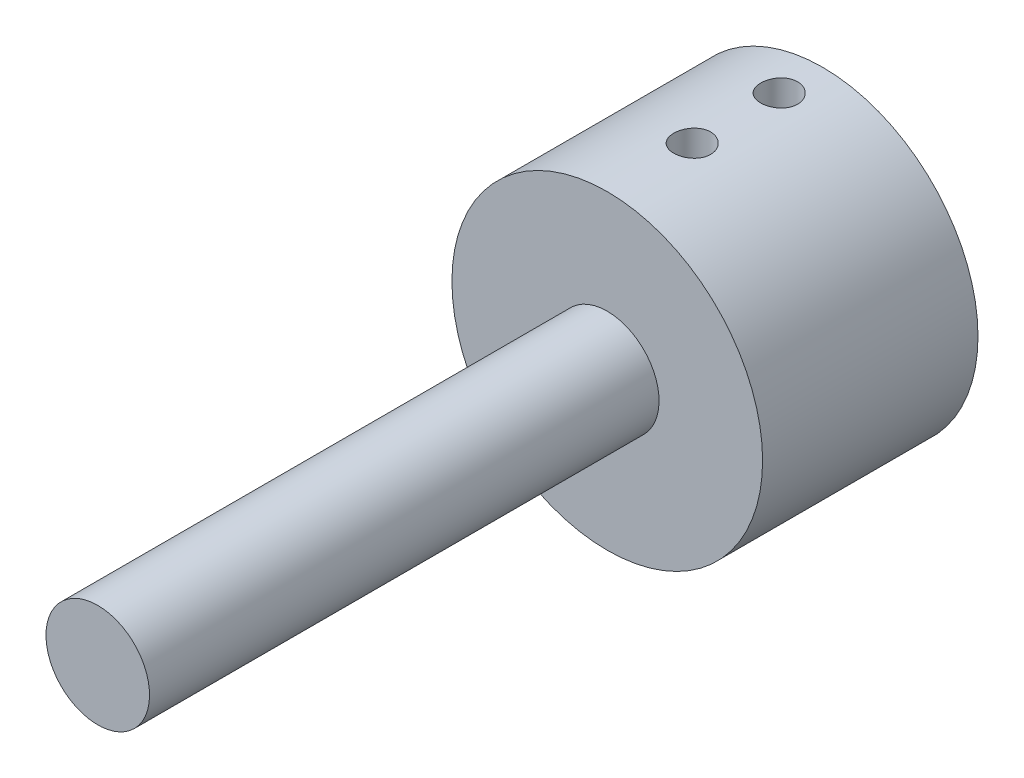
ISO-10303-21;
HEADER;
FILE_DESCRIPTION(('STEP AP214'),'2;1');
FILE_NAME('part.step','',(''),(''),'','','');
FILE_SCHEMA(('AUTOMOTIVE_DESIGN { 1 0 10303 214 1 1 1 1 }'));
ENDSEC;
DATA;
#1=APPLICATION_CONTEXT('core data for automotive mechanical design processes');
#2=APPLICATION_PROTOCOL_DEFINITION('international standard','automotive_design',2000,#1);
#3=PRODUCT_CONTEXT('',#1,'mechanical');
#4=PRODUCT('Part','Part','',(#3));
#5=PRODUCT_RELATED_PRODUCT_CATEGORY('part','',(#4));
#6=PRODUCT_DEFINITION_FORMATION('','',#4);
#7=PRODUCT_DEFINITION_CONTEXT('part definition',#1,'design');
#8=PRODUCT_DEFINITION('design','',#6,#7);
#9=PRODUCT_DEFINITION_SHAPE('','',#8);
#10=(LENGTH_UNIT() NAMED_UNIT(*) SI_UNIT(.MILLI.,.METRE.));
#11=(NAMED_UNIT(*) PLANE_ANGLE_UNIT() SI_UNIT($,.RADIAN.));
#12=(NAMED_UNIT(*) SI_UNIT($,.STERADIAN.) SOLID_ANGLE_UNIT());
#13=UNCERTAINTY_MEASURE_WITH_UNIT(LENGTH_MEASURE(1.E-05),#10,'distance_accuracy_value','');
#14=(GEOMETRIC_REPRESENTATION_CONTEXT(3) GLOBAL_UNCERTAINTY_ASSIGNED_CONTEXT((#13)) GLOBAL_UNIT_ASSIGNED_CONTEXT((#10,
#11,#12)) REPRESENTATION_CONTEXT('',''));
#15=CARTESIAN_POINT('',(0.,0.,0.));
#16=DIRECTION('',(0.,0.,1.));
#17=DIRECTION('',(1.,0.,0.));
#18=AXIS2_PLACEMENT_3D('',#15,#16,#17);
#19=CARTESIAN_POINT('',(0.,0.,0.));
#20=DIRECTION('',(0.,0.,1.));
#21=DIRECTION('',(0.,-1.,0.));
#22=AXIS2_PLACEMENT_3D('',#19,#20,#21);
#23=PLANE('',#22);
#24=CARTESIAN_POINT('',(0.,0.,0.));
#25=DIRECTION('',(0.,0.,-1.));
#26=DIRECTION('',(0.,1.,0.));
#27=AXIS2_PLACEMENT_3D('',#24,#25,#26);
#28=CIRCLE('',#27,3.175);
#29=CARTESIAN_POINT('',(0.,3.175,0.));
#30=VERTEX_POINT('',#29);
#31=EDGE_CURVE('E10',#30,#30,#28,.T.);
#32=ORIENTED_EDGE('',*,*,#31,.F.);
#33=EDGE_LOOP('',(#32));
#34=FACE_BOUND('',#33,.T.);
#35=ADVANCED_FACE('F34',(#34),#23,.T.);
#36=CARTESIAN_POINT('',(0.,0.,-33.782));
#37=DIRECTION('',(0.,0.,-1.));
#38=DIRECTION('',(0.,1.,0.));
#39=AXIS2_PLACEMENT_3D('',#36,#37,#38);
#40=CYLINDRICAL_SURFACE('',#39,3.175);
#41=ORIENTED_EDGE('',*,*,#31,.T.);
#42=EDGE_LOOP('',(#41));
#43=FACE_BOUND('',#42,.T.);
#44=CARTESIAN_POINT('',(0.,0.,-31.242));
#45=DIRECTION('',(0.,0.,-1.));
#46=DIRECTION('',(0.,1.,0.));
#47=AXIS2_PLACEMENT_3D('',#44,#45,#46);
#48=CIRCLE('',#47,3.175);
#49=CARTESIAN_POINT('',(0.,3.175,-31.242));
#50=VERTEX_POINT('',#49);
#51=EDGE_CURVE('E40',#50,#50,#48,.T.);
#52=ORIENTED_EDGE('',*,*,#51,.F.);
#53=EDGE_LOOP('',(#52));
#54=FACE_BOUND('',#53,.T.);
#55=ADVANCED_FACE('F103',(#43,#54),#40,.T.);
#56=CARTESIAN_POINT('',(0.,3.175,-31.242));
#57=DIRECTION('',(0.,0.,1.));
#58=DIRECTION('',(0.,-1.,0.));
#59=AXIS2_PLACEMENT_3D('',#56,#57,#58);
#60=PLANE('',#59);
#61=ORIENTED_EDGE('',*,*,#51,.T.);
#62=EDGE_LOOP('',(#61));
#63=FACE_BOUND('',#62,.T.);
#64=CARTESIAN_POINT('',(0.,0.,-31.242));
#65=DIRECTION('',(0.,0.,-1.));
#66=DIRECTION('',(0.,1.,0.));
#67=AXIS2_PLACEMENT_3D('',#64,#65,#66);
#68=CIRCLE('',#67,9.525);
#69=CARTESIAN_POINT('',(0.,9.525,-31.242));
#70=VERTEX_POINT('',#69);
#71=EDGE_CURVE('E44',#70,#70,#68,.T.);
#72=ORIENTED_EDGE('',*,*,#71,.F.);
#73=EDGE_LOOP('',(#72));
#74=FACE_BOUND('',#73,.T.);
#75=ADVANCED_FACE('F99',(#63,#74),#60,.T.);
#76=CARTESIAN_POINT('',(0.,0.,-33.782));
#77=DIRECTION('',(0.,0.,-1.));
#78=DIRECTION('',(0.,1.,0.));
#79=AXIS2_PLACEMENT_3D('',#76,#77,#78);
#80=CYLINDRICAL_SURFACE('',#79,9.525);
#81=CARTESIAN_POINT('',(0.,9.525,-35.3187));
#82=CARTESIAN_POINT('',(0.0632509375219132,9.52499915479188,-35.318702702457));
#83=CARTESIAN_POINT('',(0.126542029749757,9.5243633064193,-35.3240271232438));
#84=CARTESIAN_POINT('',(0.251364820472078,9.52188793721448,-35.3451842403668));
#85=CARTESIAN_POINT('',(0.312894581904218,9.52004714057458,-35.3610280749867));
#86=CARTESIAN_POINT('',(0.432369436874991,9.51536936505536,-35.4027521833042));
#87=CARTESIAN_POINT('',(0.490316847005159,9.51253303804938,-35.4286258905958));
#88=CARTESIAN_POINT('',(0.601035404846345,9.506180121912,-35.4896613468546));
#89=CARTESIAN_POINT('',(0.653807476710619,9.50266365456691,-35.524821433409));
#90=CARTESIAN_POINT('',(0.75295182295395,9.49532382723017,-35.6036190989545));
#91=CARTESIAN_POINT('',(0.799294604149035,9.49149917244225,-35.6472936697617));
#92=CARTESIAN_POINT('',(0.884010990406445,9.48398454417843,-35.7418012187883));
#93=CARTESIAN_POINT('',(0.9223842000221,9.48029457739318,-35.7926345520125));
#94=CARTESIAN_POINT('',(0.990180703567409,9.47345427413314,-35.9002065851636));
#95=CARTESIAN_POINT('',(1.01957659957805,9.47030560217059,-35.9569626673808));
#96=CARTESIAN_POINT('',(1.06840907808638,9.46492124661159,-36.0746493306869));
#97=CARTESIAN_POINT('',(1.08784600183097,9.46268553173297,-36.1355797686594));
#98=CARTESIAN_POINT('',(1.11611970355341,9.45939245018979,-36.2595806742905));
#99=CARTESIAN_POINT('',(1.12500607633105,9.45832957207026,-36.3226396848444));
#100=CARTESIAN_POINT('',(1.13207984575786,9.45748558744171,-36.4493622979969));
#101=CARTESIAN_POINT('',(1.13026763163491,9.45770443430195,-36.5130258785165));
#102=CARTESIAN_POINT('',(1.11603642445577,9.45939413033264,-36.6388058586381));
#103=CARTESIAN_POINT('',(1.10367192939602,9.4608585465419,-36.700928523007));
#104=CARTESIAN_POINT('',(1.06877210956582,9.46486434331536,-36.8222108675192));
#105=CARTESIAN_POINT('',(1.04623659739191,9.4674057437232,-36.8813704930454));
#106=CARTESIAN_POINT('',(0.991575435750875,9.47328648500057,-36.9952175219382));
#107=CARTESIAN_POINT('',(0.959425968133556,9.47662780348318,-37.0498933832251));
#108=CARTESIAN_POINT('',(0.886466559501061,9.48373033604865,-37.1530944084616));
#109=CARTESIAN_POINT('',(0.845656261347888,9.48749156744401,-37.2016193186387));
#110=CARTESIAN_POINT('',(0.756230970668205,9.49503875161689,-37.2914574218358));
#111=CARTESIAN_POINT('',(0.707568978368591,9.49882471254411,-37.332723844786));
#112=CARTESIAN_POINT('',(0.603983835638155,9.5059728190733,-37.4065098655482));
#113=CARTESIAN_POINT('',(0.54906067309011,9.50933496385503,-37.439029446432));
#114=CARTESIAN_POINT('',(0.434477192227891,9.51525841591306,-37.494398181288));
#115=CARTESIAN_POINT('',(0.374815519825478,9.51781949323438,-37.5172445591283));
#116=CARTESIAN_POINT('',(0.252465658532564,9.52185010274536,-37.5525820185042));
#117=CARTESIAN_POINT('',(0.189777597381649,9.52331968096283,-37.5650735367002));
#118=CARTESIAN_POINT('',(0.0635590107666497,9.52499574893122,-37.5792864230902));
#119=CARTESIAN_POINT('',(3.58400083117784E-05,9.52520979797053,-37.5810722495362));
#120=CARTESIAN_POINT('',(-0.126404631849715,9.5243710616825,-37.5739929441287));
#121=CARTESIAN_POINT('',(-0.189321944527945,9.52331830061377,-37.5651280162303));
#122=CARTESIAN_POINT('',(-0.312575650423431,9.52006897220777,-37.5370523750671));
#123=CARTESIAN_POINT('',(-0.372919106821376,9.51787578670261,-37.5178722449288));
#124=CARTESIAN_POINT('',(-0.489532754276608,9.51259128030109,-37.4697423480784));
#125=CARTESIAN_POINT('',(-0.545802819522163,9.50949993167863,-37.4407922797659));
#126=CARTESIAN_POINT('',(-0.652961239170924,9.50274519697551,-37.3737872720358));
#127=CARTESIAN_POINT('',(-0.703823242482478,9.49907920769755,-37.3356904572299));
#128=CARTESIAN_POINT('',(-0.798454027403535,9.49159384532421,-37.2515328448835));
#129=CARTESIAN_POINT('',(-0.84222255607325,9.48777446676533,-37.2054717634733));
#130=CARTESIAN_POINT('',(-0.921651327981495,9.48038962493189,-37.1064099088574));
#131=CARTESIAN_POINT('',(-0.957268957312502,9.47682556018668,-37.0533748480892));
#132=CARTESIAN_POINT('',(-1.01909088187736,9.47037744686408,-36.9420376295353));
#133=CARTESIAN_POINT('',(-1.04529534989561,9.46749338580514,-36.8837355684534));
#134=CARTESIAN_POINT('',(-1.08747746493127,9.46274116392142,-36.7636591902606));
#135=CARTESIAN_POINT('',(-1.10347950086257,9.46087058199655,-36.7018935407056));
#136=CARTESIAN_POINT('',(-1.12488122562179,9.45835002776142,-36.5765283733488));
#137=CARTESIAN_POINT('',(-1.13028135522926,9.45770000470587,-36.5129289318993));
#138=CARTESIAN_POINT('',(-1.1303184331302,9.45769553968786,-36.3861253574961));
#139=CARTESIAN_POINT('',(-1.12502232452988,9.45833303967828,-36.3229212338964));
#140=CARTESIAN_POINT('',(-1.10395863981905,9.46081450631757,-36.1983079862245));
#141=CARTESIAN_POINT('',(-1.08819105929352,9.46265847347512,-36.1368988629091));
#142=CARTESIAN_POINT('',(-1.04665229311139,9.4673426850713,-36.0176253668864));
#143=CARTESIAN_POINT('',(-1.02088399489125,9.47018264192209,-35.9597599766002));
#144=CARTESIAN_POINT('',(-0.960081888687949,9.47653934827967,-35.8491640260058));
#145=CARTESIAN_POINT('',(-0.925048010140115,9.48005610294073,-35.7964335048079));
#146=CARTESIAN_POINT('',(-0.846459876445608,9.4873965412942,-35.6972615737252));
#147=CARTESIAN_POINT('',(-0.802855698093826,9.49122194198921,-35.6508598499357));
#148=CARTESIAN_POINT('',(-0.70846795098953,9.49873331929354,-35.5660056558302));
#149=CARTESIAN_POINT('',(-0.657682685184869,9.50241926268422,-35.5275550698509));
#150=CARTESIAN_POINT('',(-0.550175875241669,9.50925025151029,-35.4595838375354));
#151=CARTESIAN_POINT('',(-0.493434507280825,9.51239339223359,-35.4300943717792));
#152=CARTESIAN_POINT('',(-0.375800731512537,9.51776504462355,-35.3811036553447));
#153=CARTESIAN_POINT('',(-0.314912964671017,9.51999455988771,-35.3615914390047));
#154=CARTESIAN_POINT('',(-0.211418114793812,9.5227440281588,-35.3378334578865));
#155=CARTESIAN_POINT('',(-0.169466299617016,9.52358594491639,-35.3306685819335));
#156=CARTESIAN_POINT('',(-0.0850157018599237,9.524714213129,-35.3211009599601));
#157=CARTESIAN_POINT('',(-0.0425169227863944,9.52500056814412,-35.3186981834237));
#158=CARTESIAN_POINT('',(0.,9.525,-35.3187));
#159=B_SPLINE_CURVE_WITH_KNOTS('',3,(#81,#82,#83,#84,#85,#86,#87,#88,#89,#90,#91,#92,#93,#94,
#95,#96,#97,#98,#99,#100,#101,#102,#103,#104,#105,#106,#107,#108,#109,#110,#111,#112,#113,#114,
#115,#116,#117,#118,#119,#120,#121,#122,#123,#124,#125,#126,#127,#128,#129,#130,#131,#132,#133,
#134,#135,#136,#137,#138,#139,#140,#141,#142,#143,#144,#145,#146,#147,#148,#149,#150,#151,#152,
#153,#154,#155,#156,#157,#158),.UNSPECIFIED.,.T.,.F.,(4,2,2,2,2,2,2,2,2,2,2,2,2,2,2,2,2,2,2,2,2,
2,2,2,2,2,2,2,2,2,2,2,2,2,2,2,2,2,4),(0.,0.189597524312163,0.379396121234884,0.569070669169936,
0.758711285265451,0.949194948105546,1.13968806040505,1.33075686013229,1.52181911239724,
1.71197964005891,1.90213324948718,2.0913106992798,2.28049163485501,2.4701451964838,
2.65980658018673,2.8506485273792,3.04149084391374,3.232387893604,3.4232768928326,
3.61301539850876,3.80275027087081,3.99192568241038,4.18110693437604,4.37117138460746,
4.56124261068453,4.75228593782412,4.94332575806604,5.13390716820241,5.32448065465381,
5.51386512071869,5.70324966663246,5.89257957351564,6.08191092233626,6.27237971236644,
6.46289358990969,6.65406297150348,6.8450217911509,6.97246899232318,7.09991537679581),.UNSPECIFIED.);
#160=CARTESIAN_POINT('',(0.,9.525,-35.3187));
#161=VERTEX_POINT('',#160);
#162=EDGE_CURVE('E164',#161,#161,#159,.T.);
#163=ORIENTED_EDGE('',*,*,#162,.F.);
#164=EDGE_LOOP('',(#163));
#165=FACE_BOUND('',#164,.T.);
#166=CARTESIAN_POINT('',(0.,9.525,-40.6527));
#167=CARTESIAN_POINT('',(0.0632509375219132,9.52499915479188,-40.652702702457));
#168=CARTESIAN_POINT('',(0.126542029749757,9.5243633064193,-40.6580271232438));
#169=CARTESIAN_POINT('',(0.251364820472078,9.52188793721448,-40.6791842403668));
#170=CARTESIAN_POINT('',(0.312894581904218,9.52004714057458,-40.6950280749867));
#171=CARTESIAN_POINT('',(0.432369436874992,9.51536936505536,-40.7367521833042));
#172=CARTESIAN_POINT('',(0.490316847005161,9.51253303804938,-40.7626258905958));
#173=CARTESIAN_POINT('',(0.601035404846347,9.506180121912,-40.8236613468546));
#174=CARTESIAN_POINT('',(0.653807476710621,9.50266365456691,-40.858821433409));
#175=CARTESIAN_POINT('',(0.752951822953951,9.49532382723017,-40.9376190989545));
#176=CARTESIAN_POINT('',(0.799294604149037,9.49149917244225,-40.9812936697617));
#177=CARTESIAN_POINT('',(0.884010990406447,9.48398454417843,-41.0758012187883));
#178=CARTESIAN_POINT('',(0.922384200022101,9.48029457739318,-41.1266345520125));
#179=CARTESIAN_POINT('',(0.990180703567408,9.47345427413314,-41.2342065851636));
#180=CARTESIAN_POINT('',(1.01957659957805,9.47030560217059,-41.2909626673808));
#181=CARTESIAN_POINT('',(1.06840907808638,9.46492124661159,-41.4086493306869));
#182=CARTESIAN_POINT('',(1.08784600183097,9.46268553173297,-41.4695797686594));
#183=CARTESIAN_POINT('',(1.11611970355341,9.45939245018979,-41.5935806742905));
#184=CARTESIAN_POINT('',(1.12500607633105,9.45832957207026,-41.6566396848444));
#185=CARTESIAN_POINT('',(1.13207984575786,9.45748558744171,-41.7833622979969));
#186=CARTESIAN_POINT('',(1.13026763163491,9.45770443430195,-41.8470258785165));
#187=CARTESIAN_POINT('',(1.11603642445577,9.45939413033264,-41.9728058586381));
#188=CARTESIAN_POINT('',(1.10367192939602,9.4608585465419,-42.034928523007));
#189=CARTESIAN_POINT('',(1.06877210956582,9.46486434331535,-42.1562108675192));
#190=CARTESIAN_POINT('',(1.04623659739191,9.4674057437232,-42.2153704930454));
#191=CARTESIAN_POINT('',(0.991575435750874,9.47328648500057,-42.3292175219382));
#192=CARTESIAN_POINT('',(0.959425968133554,9.47662780348318,-42.3838933832251));
#193=CARTESIAN_POINT('',(0.886466559501059,9.48373033604865,-42.4870944084616));
#194=CARTESIAN_POINT('',(0.845656261347887,9.48749156744401,-42.5356193186387));
#195=CARTESIAN_POINT('',(0.756230970668205,9.49503875161689,-42.6254574218358));
#196=CARTESIAN_POINT('',(0.707568978368591,9.49882471254411,-42.666723844786));
#197=CARTESIAN_POINT('',(0.603983835638155,9.5059728190733,-42.7405098655482));
#198=CARTESIAN_POINT('',(0.54906067309011,9.50933496385503,-42.773029446432));
#199=CARTESIAN_POINT('',(0.434477192227891,9.51525841591306,-42.828398181288));
#200=CARTESIAN_POINT('',(0.37481551982548,9.51781949323438,-42.8512445591283));
#201=CARTESIAN_POINT('',(0.252465658532566,9.52185010274536,-42.8865820185042));
#202=CARTESIAN_POINT('',(0.18977759738165,9.52331968096283,-42.8990735367002));
#203=CARTESIAN_POINT('',(0.06355901076665,9.52499574893122,-42.9132864230902));
#204=CARTESIAN_POINT('',(3.5840008312185E-05,9.52520979797053,-42.9150722495362));
#205=CARTESIAN_POINT('',(-0.126404631849715,9.5243710616825,-42.9079929441287));
#206=CARTESIAN_POINT('',(-0.189321944527945,9.52331830061377,-42.8991280162303));
#207=CARTESIAN_POINT('',(-0.312575650423429,9.52006897220777,-42.8710523750671));
#208=CARTESIAN_POINT('',(-0.372919106821373,9.51787578670261,-42.8518722449288));
#209=CARTESIAN_POINT('',(-0.489532754276604,9.51259128030109,-42.8037423480784));
#210=CARTESIAN_POINT('',(-0.545802819522161,9.50949993167863,-42.7747922797659));
#211=CARTESIAN_POINT('',(-0.652961239170924,9.50274519697551,-42.7077872720358));
#212=CARTESIAN_POINT('',(-0.703823242482478,9.49907920769755,-42.6696904572299));
#213=CARTESIAN_POINT('',(-0.798454027403535,9.49159384532421,-42.5855328448835));
#214=CARTESIAN_POINT('',(-0.84222255607325,9.48777446676533,-42.5394717634733));
#215=CARTESIAN_POINT('',(-0.921651327981495,9.48038962493189,-42.4404099088574));
#216=CARTESIAN_POINT('',(-0.957268957312502,9.47682556018668,-42.3873748480892));
#217=CARTESIAN_POINT('',(-1.01909088187736,9.47037744686408,-42.2760376295353));
#218=CARTESIAN_POINT('',(-1.04529534989561,9.46749338580514,-42.2177355684534));
#219=CARTESIAN_POINT('',(-1.08747746493127,9.46274116392142,-42.0976591902606));
#220=CARTESIAN_POINT('',(-1.10347950086257,9.46087058199655,-42.0358935407056));
#221=CARTESIAN_POINT('',(-1.12488122562179,9.45835002776142,-41.9105283733488));
#222=CARTESIAN_POINT('',(-1.13028135522926,9.45770000470587,-41.8469289318993));
#223=CARTESIAN_POINT('',(-1.1303184331302,9.45769553968786,-41.7201253574961));
#224=CARTESIAN_POINT('',(-1.12502232452988,9.45833303967828,-41.6569212338964));
#225=CARTESIAN_POINT('',(-1.10395863981905,9.46081450631757,-41.5323079862245));
#226=CARTESIAN_POINT('',(-1.08819105929352,9.46265847347512,-41.4708988629091));
#227=CARTESIAN_POINT('',(-1.04665229311139,9.4673426850713,-41.3516253668864));
#228=CARTESIAN_POINT('',(-1.02088399489125,9.47018264192209,-41.2937599766002));
#229=CARTESIAN_POINT('',(-0.960081888687952,9.47653934827967,-41.1831640260058));
#230=CARTESIAN_POINT('',(-0.925048010140117,9.48005610294073,-41.1304335048079));
#231=CARTESIAN_POINT('',(-0.846459876445607,9.4873965412942,-41.0312615737252));
#232=CARTESIAN_POINT('',(-0.802855698093823,9.49122194198921,-40.9848598499357));
#233=CARTESIAN_POINT('',(-0.708467950989527,9.49873331929354,-40.9000056558302));
#234=CARTESIAN_POINT('',(-0.657682685184868,9.50241926268422,-40.8615550698509));
#235=CARTESIAN_POINT('',(-0.55017587524167,9.50925025151029,-40.7935838375354));
#236=CARTESIAN_POINT('',(-0.493434507280827,9.51239339223359,-40.7640943717792));
#237=CARTESIAN_POINT('',(-0.375800731512539,9.51776504462355,-40.7151036553446));
#238=CARTESIAN_POINT('',(-0.314912964671018,9.51999455988771,-40.6955914390047));
#239=CARTESIAN_POINT('',(-0.211418114793812,9.5227440281588,-40.6718334578865));
#240=CARTESIAN_POINT('',(-0.169466299617016,9.52358594491639,-40.6646685819335));
#241=CARTESIAN_POINT('',(-0.0850157018599243,9.524714213129,-40.6551009599601));
#242=CARTESIAN_POINT('',(-0.0425169227863947,9.52500056814412,-40.6526981834237));
#243=CARTESIAN_POINT('',(0.,9.525,-40.6527));
#244=B_SPLINE_CURVE_WITH_KNOTS('',3,(#166,#167,#168,#169,#170,#171,#172,#173,#174,#175,#176,
#177,#178,#179,#180,#181,#182,#183,#184,#185,#186,#187,#188,#189,#190,#191,#192,#193,#194,#195,
#196,#197,#198,#199,#200,#201,#202,#203,#204,#205,#206,#207,#208,#209,#210,#211,#212,#213,#214,
#215,#216,#217,#218,#219,#220,#221,#222,#223,#224,#225,#226,#227,#228,#229,#230,#231,#232,#233,
#234,#235,#236,#237,#238,#239,#240,#241,#242,#243),.UNSPECIFIED.,.T.,.F.,(4,2,2,2,2,2,2,2,2,2,2,
2,2,2,2,2,2,2,2,2,2,2,2,2,2,2,2,2,2,2,2,2,2,2,2,2,2,2,4),(0.,0.189597524312163,
0.379396121234884,0.569070669169938,0.758711285265451,0.949194948105553,1.13968806040505,
1.33075686013228,1.52181911239724,1.71197964005891,1.90213324948718,2.09131069927981,
2.28049163485501,2.4701451964838,2.65980658018673,2.8506485273792,3.04149084391374,
3.232387893604,3.4232768928326,3.61301539850876,3.80275027087081,3.99192568241037,
4.18110693437604,4.37117138460746,4.56124261068453,4.75228593782412,4.94332575806604,
5.13390716820241,5.32448065465381,5.5138651207187,5.70324966663246,5.89257957351563,
6.08191092233626,6.27237971236644,6.46289358990969,6.65406297150348,6.8450217911509,
6.97246899232318,7.09991537679581),.UNSPECIFIED.);
#245=CARTESIAN_POINT('',(0.,9.525,-40.6527));
#246=VERTEX_POINT('',#245);
#247=EDGE_CURVE('E59',#246,#246,#244,.T.);
#248=ORIENTED_EDGE('',*,*,#247,.F.);
#249=EDGE_LOOP('',(#248));
#250=FACE_BOUND('',#249,.T.);
#251=ORIENTED_EDGE('',*,*,#71,.T.);
#252=EDGE_LOOP('',(#251));
#253=FACE_BOUND('',#252,.T.);
#254=CARTESIAN_POINT('',(0.,0.,-44.45));
#255=DIRECTION('',(0.,0.,-1.));
#256=DIRECTION('',(0.,1.,0.));
#257=AXIS2_PLACEMENT_3D('',#254,#255,#256);
#258=CIRCLE('',#257,9.525);
#259=CARTESIAN_POINT('',(0.,9.525,-44.45));
#260=VERTEX_POINT('',#259);
#261=EDGE_CURVE('E48',#260,#260,#258,.T.);
#262=ORIENTED_EDGE('',*,*,#261,.F.);
#263=EDGE_LOOP('',(#262));
#264=FACE_BOUND('',#263,.T.);
#265=ADVANCED_FACE('F71',(#165,#250,#253,#264),#80,.T.);
#266=CARTESIAN_POINT('',(0.,9.525,-44.45));
#267=DIRECTION('',(0.,0.,-1.));
#268=DIRECTION('',(0.,1.,0.));
#269=AXIS2_PLACEMENT_3D('',#266,#267,#268);
#270=PLANE('',#269);
#271=ORIENTED_EDGE('',*,*,#261,.T.);
#272=EDGE_LOOP('',(#271));
#273=FACE_BOUND('',#272,.T.);
#274=CARTESIAN_POINT('',(0.,0.,-44.45));
#275=DIRECTION('',(0.,0.,-1.));
#276=DIRECTION('',(0.,1.,0.));
#277=AXIS2_PLACEMENT_3D('',#274,#275,#276);
#278=CIRCLE('',#277,6.35);
#279=CARTESIAN_POINT('',(0.,6.35,-44.45));
#280=VERTEX_POINT('',#279);
#281=EDGE_CURVE('E53',#280,#280,#278,.T.);
#282=ORIENTED_EDGE('',*,*,#281,.F.);
#283=EDGE_LOOP('',(#282));
#284=FACE_BOUND('',#283,.T.);
#285=ADVANCED_FACE('F92',(#273,#284),#270,.T.);
#286=CARTESIAN_POINT('',(0.,0.,-33.782));
#287=DIRECTION('',(0.,0.,-1.));
#288=DIRECTION('',(0.,1.,0.));
#289=AXIS2_PLACEMENT_3D('',#286,#287,#288);
#290=CYLINDRICAL_SURFACE('',#289,6.35);
#291=CARTESIAN_POINT('',(0.,6.35,-35.3187));
#292=CARTESIAN_POINT('',(-0.0629563878791093,6.3499988839214,-35.3187024641412));
#293=CARTESIAN_POINT('',(-0.125945518180088,6.34905403128448,-35.3239776681979));
#294=CARTESIAN_POINT('',(-0.250152702081869,6.3453758553173,-35.344927785077));
#295=CARTESIAN_POINT('',(-0.31136914852081,6.34264095902063,-35.3606118446503));
#296=CARTESIAN_POINT('',(-0.430216353374723,6.33568901554255,-35.401887439373));
#297=CARTESIAN_POINT('',(-0.487850157656375,6.33147324821675,-35.4274704212254));
#298=CARTESIAN_POINT('',(-0.598001091171557,6.32202140996737,-35.4877942395897));
#299=CARTESIAN_POINT('',(-0.650518713767404,6.31678543757031,-35.5225341918794));
#300=CARTESIAN_POINT('',(-0.74952221648712,6.3058088163252,-35.60058606018));
#301=CARTESIAN_POINT('',(-0.795944583557262,6.30006376112309,-35.6439779269824));
#302=CARTESIAN_POINT('',(-0.880890742796278,6.28874965760557,-35.7379298435214));
#303=CARTESIAN_POINT('',(-0.919414000884791,6.28318062121279,-35.7884903775606));
#304=CARTESIAN_POINT('',(-0.987728082473347,6.27280636489557,-35.8957874026684));
#305=CARTESIAN_POINT('',(-1.01745513923004,6.26800683286247,-35.9525650910238));
#306=CARTESIAN_POINT('',(-1.0669249737415,6.2597766722081,-36.0704081066579));
#307=CARTESIAN_POINT('',(-1.08666852406106,6.25634593766797,-36.1314731017506));
#308=CARTESIAN_POINT('',(-1.11540879351234,6.2512859511231,-36.2554806221497));
#309=CARTESIAN_POINT('',(-1.12451576700911,6.24963823052388,-36.3183968264517));
#310=CARTESIAN_POINT('',(-1.1320664164924,6.24827506974414,-36.4448841726389));
#311=CARTESIAN_POINT('',(-1.13051095346756,6.24855947354512,-36.5084552612283));
#312=CARTESIAN_POINT('',(-1.11687047479473,6.25101158981713,-36.6336545925669));
#313=CARTESIAN_POINT('',(-1.10491011333064,6.25315700585985,-36.6952969171495));
#314=CARTESIAN_POINT('',(-1.07099533738571,6.25905444840308,-36.8156858147278));
#315=CARTESIAN_POINT('',(-1.049040536489,6.26280653702218,-36.874432275663));
#316=CARTESIAN_POINT('',(-0.995636097085758,6.27151823317761,-36.9877305440266));
#317=CARTESIAN_POINT('',(-0.964135455052852,6.27648429874686,-37.0422577933252));
#318=CARTESIAN_POINT('',(-0.892569656940641,6.28706003112925,-37.1452996839654));
#319=CARTESIAN_POINT('',(-0.852503715015032,6.29266975697482,-37.1938137729679));
#320=CARTESIAN_POINT('',(-0.764269222158467,6.30399827594321,-37.2841730646175));
#321=CARTESIAN_POINT('',(-0.715993892439709,6.30971748810976,-37.3259140169538));
#322=CARTESIAN_POINT('',(-0.613070078093332,6.32054731368641,-37.4007197140683));
#323=CARTESIAN_POINT('',(-0.558421540967499,6.32565792208254,-37.4337843873699));
#324=CARTESIAN_POINT('',(-0.444198884642503,6.33470353710574,-37.4903115248425));
#325=CARTESIAN_POINT('',(-0.384619676136643,6.33863730921634,-37.5137639150777));
#326=CARTESIAN_POINT('',(-0.262282092255563,6.34487632476616,-37.5502994409265));
#327=CARTESIAN_POINT('',(-0.199524021375926,6.34718172386838,-37.5633835677003));
#328=CARTESIAN_POINT('',(-0.0735078508517704,6.34988306770141,-37.5786678304126));
#329=CARTESIAN_POINT('',(-0.0102676109126003,6.35030409228237,-37.5810109329397));
#330=CARTESIAN_POINT('',(0.115701348621398,6.34925825163246,-37.5751290288385));
#331=CARTESIAN_POINT('',(0.178430090650149,6.34779146965248,-37.5669044882357));
#332=CARTESIAN_POINT('',(0.301147522772468,6.34315039678748,-37.5402396575751));
#333=CARTESIAN_POINT('',(0.36115226452032,6.33998807934095,-37.5218709758914));
#334=CARTESIAN_POINT('',(0.477230535073565,6.33230904006331,-37.4755162302778));
#335=CARTESIAN_POINT('',(0.533303817796234,6.32779223354356,-37.447529564973));
#336=CARTESIAN_POINT('',(0.640542721018921,6.31784277068134,-37.3824116999382));
#337=CARTESIAN_POINT('',(0.69165391851603,6.31240144327335,-37.3451922252926));
#338=CARTESIAN_POINT('',(0.786956260083879,6.30123054524763,-37.262785640016));
#339=CARTESIAN_POINT('',(0.831146825340833,6.29550095057328,-37.2175978636195));
#340=CARTESIAN_POINT('',(0.911890524213836,6.28431705815893,-37.1198929168132));
#341=CARTESIAN_POINT('',(0.948346537135835,6.27886684675114,-37.0672949418994));
#342=CARTESIAN_POINT('',(1.01190558831821,6.26893820466268,-36.9566375448361));
#343=CARTESIAN_POINT('',(1.03900895164483,6.2644597402094,-36.8985783125905));
#344=CARTESIAN_POINT('',(1.08295206493416,6.25701307344201,-36.7789047805981));
#345=CARTESIAN_POINT('',(1.09983812432204,6.25403806705127,-36.7173079281452));
#346=CARTESIAN_POINT('',(1.12301156564012,6.24991887731239,-36.5920940845072));
#347=CARTESIAN_POINT('',(1.12930001283747,6.24877450994984,-36.5284772970202));
#348=CARTESIAN_POINT('',(1.13106684825176,6.24845484979013,-36.4020007842967));
#349=CARTESIAN_POINT('',(1.12669827021579,6.24925168135855,-36.3391432157054));
#350=CARTESIAN_POINT('',(1.10760816297116,6.25266316282823,-36.2150732439359));
#351=CARTESIAN_POINT('',(1.09288668165288,6.25527780432068,-36.153860833149));
#352=CARTESIAN_POINT('',(1.05357047523371,6.26201909575184,-36.0348902394755));
#353=CARTESIAN_POINT('',(1.02899073220675,6.26614345047997,-35.9771269671203));
#354=CARTESIAN_POINT('',(0.970671955669598,6.27544134328702,-35.8665194419059));
#355=CARTESIAN_POINT('',(0.936932364525779,6.28061494523719,-35.8136754887884));
#356=CARTESIAN_POINT('',(0.860712930365977,6.29151580295166,-35.713636922572));
#357=CARTESIAN_POINT('',(0.818121129276666,6.29724959616528,-35.666528309166));
#358=CARTESIAN_POINT('',(0.725641135508029,6.30857437800572,-35.5800751818433));
#359=CARTESIAN_POINT('',(0.675751266606112,6.31416533347807,-35.5407324564886));
#360=CARTESIAN_POINT('',(0.569614887399337,6.32462666894718,-35.4706367444014));
#361=CARTESIAN_POINT('',(0.51332073621519,6.32949092933149,-35.4399549615021));
#362=CARTESIAN_POINT('',(0.396310768817328,6.33789122140251,-35.388532318826));
#363=CARTESIAN_POINT('',(0.335599289969207,6.34142853555049,-35.3677818552909));
#364=CARTESIAN_POINT('',(0.228901192837829,6.3460311949866,-35.3411616032305));
#365=CARTESIAN_POINT('',(0.183549007984971,6.34751130526661,-35.3327524660716));
#366=CARTESIAN_POINT('',(0.0921370516835585,6.34949610579554,-35.3215208222923));
#367=CARTESIAN_POINT('',(0.0460772953483353,6.35000081684933,-35.318698196514));
#368=CARTESIAN_POINT('',(0.,6.35,-35.3187));
#369=B_SPLINE_CURVE_WITH_KNOTS('',3,(#291,#292,#293,#294,#295,#296,#297,#298,#299,#300,#301,
#302,#303,#304,#305,#306,#307,#308,#309,#310,#311,#312,#313,#314,#315,#316,#317,#318,#319,#320,
#321,#322,#323,#324,#325,#326,#327,#328,#329,#330,#331,#332,#333,#334,#335,#336,#337,#338,#339,
#340,#341,#342,#343,#344,#345,#346,#347,#348,#349,#350,#351,#352,#353,#354,#355,#356,#357,#358,
#359,#360,#361,#362,#363,#364,#365,#366,#367,#368),.UNSPECIFIED.,.T.,.F.,(4,2,2,2,2,2,2,2,2,2,2,
2,2,2,2,2,2,2,2,2,2,2,2,2,2,2,2,2,2,2,2,2,2,2,2,2,2,2,4),(0.,0.188700695089458,
0.377567430304385,0.566271335794897,0.754957026188631,0.945474674221972,1.13600519943005,
1.32788488763883,1.51974972513488,1.70960760659306,1.89945015726347,2.08704917225956,
2.27465544102885,2.4632823148854,2.65192650225096,2.84324403808115,3.03456314996839,
3.22608225995457,3.41758305935036,3.6065273740334,3.79546335669533,3.98308236329304,
4.17071310310582,4.36021202617093,4.54972678970789,4.74149628669667,4.93325911775941,
5.1241461524447,5.31501399810742,5.50315717677205,5.69129948513105,5.879156941514,
6.06702583685677,6.25743369109013,6.44788534712722,6.63985995513198,6.83164854337839,
6.96976007448539,7.10786865969789),.UNSPECIFIED.);
#370=CARTESIAN_POINT('',(0.,6.35,-35.3187));
#371=VERTEX_POINT('',#370);
#372=EDGE_CURVE('E161',#371,#371,#369,.T.);
#373=ORIENTED_EDGE('',*,*,#372,.F.);
#374=EDGE_LOOP('',(#373));
#375=FACE_BOUND('',#374,.T.);
#376=CARTESIAN_POINT('',(0.,6.35,-40.6527));
#377=CARTESIAN_POINT('',(-0.0629563878791093,6.3499988839214,-40.6527024641412));
#378=CARTESIAN_POINT('',(-0.125945518180088,6.34905403128448,-40.6579776681979));
#379=CARTESIAN_POINT('',(-0.250152702081869,6.3453758553173,-40.678927785077));
#380=CARTESIAN_POINT('',(-0.31136914852081,6.34264095902063,-40.6946118446503));
#381=CARTESIAN_POINT('',(-0.430216353374723,6.33568901554255,-40.735887439373));
#382=CARTESIAN_POINT('',(-0.487850157656376,6.33147324821675,-40.7614704212254));
#383=CARTESIAN_POINT('',(-0.598001091171557,6.32202140996737,-40.8217942395897));
#384=CARTESIAN_POINT('',(-0.650518713767404,6.31678543757031,-40.8565341918794));
#385=CARTESIAN_POINT('',(-0.749522216487121,6.3058088163252,-40.93458606018));
#386=CARTESIAN_POINT('',(-0.795944583557266,6.30006376112309,-40.9779779269824));
#387=CARTESIAN_POINT('',(-0.880890742796281,6.28874965760557,-41.0719298435214));
#388=CARTESIAN_POINT('',(-0.919414000884792,6.28318062121279,-41.1224903775606));
#389=CARTESIAN_POINT('',(-0.987728082473345,6.27280636489557,-41.2297874026684));
#390=CARTESIAN_POINT('',(-1.01745513923004,6.26800683286247,-41.2865650910238));
#391=CARTESIAN_POINT('',(-1.0669249737415,6.2597766722081,-41.4044081066578));
#392=CARTESIAN_POINT('',(-1.08666852406106,6.25634593766797,-41.4654731017506));
#393=CARTESIAN_POINT('',(-1.11540879351234,6.2512859511231,-41.5894806221497));
#394=CARTESIAN_POINT('',(-1.12451576700911,6.24963823052388,-41.6523968264517));
#395=CARTESIAN_POINT('',(-1.1320664164924,6.24827506974414,-41.7788841726388));
#396=CARTESIAN_POINT('',(-1.13051095346756,6.24855947354512,-41.8424552612283));
#397=CARTESIAN_POINT('',(-1.11687047479473,6.25101158981713,-41.9676545925669));
#398=CARTESIAN_POINT('',(-1.10491011333064,6.25315700585985,-42.0292969171495));
#399=CARTESIAN_POINT('',(-1.07099533738571,6.25905444840308,-42.1496858147278));
#400=CARTESIAN_POINT('',(-1.049040536489,6.26280653702218,-42.208432275663));
#401=CARTESIAN_POINT('',(-0.995636097085758,6.27151823317761,-42.3217305440266));
#402=CARTESIAN_POINT('',(-0.964135455052852,6.27648429874686,-42.3762577933252));
#403=CARTESIAN_POINT('',(-0.892569656940641,6.28706003112925,-42.4792996839654));
#404=CARTESIAN_POINT('',(-0.852503715015032,6.29266975697482,-42.5278137729679));
#405=CARTESIAN_POINT('',(-0.764269222158466,6.30399827594321,-42.6181730646175));
#406=CARTESIAN_POINT('',(-0.715993892439708,6.30971748810977,-42.6599140169538));
#407=CARTESIAN_POINT('',(-0.613070078093331,6.32054731368641,-42.7347197140683));
#408=CARTESIAN_POINT('',(-0.558421540967498,6.32565792208254,-42.7677843873699));
#409=CARTESIAN_POINT('',(-0.444198884642503,6.33470353710574,-42.8243115248425));
#410=CARTESIAN_POINT('',(-0.384619676136642,6.33863730921634,-42.8477639150777));
#411=CARTESIAN_POINT('',(-0.262282092255563,6.34487632476617,-42.8842994409265));
#412=CARTESIAN_POINT('',(-0.199524021375926,6.34718172386838,-42.8973835677003));
#413=CARTESIAN_POINT('',(-0.0735078508517704,6.34988306770141,-42.9126678304126));
#414=CARTESIAN_POINT('',(-0.0102676109126003,6.35030409228237,-42.9150109329397));
#415=CARTESIAN_POINT('',(0.115701348621398,6.34925825163246,-42.9091290288385));
#416=CARTESIAN_POINT('',(0.178430090650149,6.34779146965248,-42.9009044882357));
#417=CARTESIAN_POINT('',(0.301147522772468,6.34315039678748,-42.8742396575751));
#418=CARTESIAN_POINT('',(0.36115226452032,6.33998807934095,-42.8558709758914));
#419=CARTESIAN_POINT('',(0.477230535073565,6.33230904006331,-42.8095162302778));
#420=CARTESIAN_POINT('',(0.533303817796235,6.32779223354356,-42.781529564973));
#421=CARTESIAN_POINT('',(0.64054272101892,6.31784277068135,-42.7164116999382));
#422=CARTESIAN_POINT('',(0.691653918516027,6.31240144327335,-42.6791922252926));
#423=CARTESIAN_POINT('',(0.786956260083877,6.30123054524763,-42.596785640016));
#424=CARTESIAN_POINT('',(0.831146825340833,6.29550095057328,-42.5515978636195));
#425=CARTESIAN_POINT('',(0.911890524213835,6.28431705815893,-42.4538929168132));
#426=CARTESIAN_POINT('',(0.948346537135832,6.27886684675114,-42.4012949418994));
#427=CARTESIAN_POINT('',(1.01190558831821,6.26893820466268,-42.2906375448361));
#428=CARTESIAN_POINT('',(1.03900895164483,6.2644597402094,-42.2325783125905));
#429=CARTESIAN_POINT('',(1.08295206493416,6.25701307344201,-42.1129047805981));
#430=CARTESIAN_POINT('',(1.09983812432205,6.25403806705127,-42.0513079281452));
#431=CARTESIAN_POINT('',(1.12301156564012,6.24991887731239,-41.9260940845072));
#432=CARTESIAN_POINT('',(1.12930001283747,6.24877450994984,-41.8624772970202));
#433=CARTESIAN_POINT('',(1.13106684825176,6.24845484979013,-41.7360007842967));
#434=CARTESIAN_POINT('',(1.12669827021579,6.24925168135855,-41.6731432157054));
#435=CARTESIAN_POINT('',(1.10760816297116,6.25266316282823,-41.5490732439359));
#436=CARTESIAN_POINT('',(1.09288668165288,6.25527780432068,-41.487860833149));
#437=CARTESIAN_POINT('',(1.05357047523371,6.26201909575184,-41.3688902394755));
#438=CARTESIAN_POINT('',(1.02899073220675,6.26614345047997,-41.3111269671203));
#439=CARTESIAN_POINT('',(0.970671955669598,6.27544134328702,-41.2005194419059));
#440=CARTESIAN_POINT('',(0.936932364525779,6.28061494523719,-41.1476754887884));
#441=CARTESIAN_POINT('',(0.860712930365978,6.29151580295166,-41.047636922572));
#442=CARTESIAN_POINT('',(0.818121129276669,6.29724959616528,-41.000528309166));
#443=CARTESIAN_POINT('',(0.725641135508032,6.30857437800572,-40.9140751818433));
#444=CARTESIAN_POINT('',(0.675751266606114,6.31416533347807,-40.8747324564886));
#445=CARTESIAN_POINT('',(0.569614887399337,6.32462666894718,-40.8046367444014));
#446=CARTESIAN_POINT('',(0.513320736215191,6.32949092933149,-40.7739549615021));
#447=CARTESIAN_POINT('',(0.396310768817329,6.33789122140251,-40.722532318826));
#448=CARTESIAN_POINT('',(0.335599289969207,6.34142853555049,-40.7017818552909));
#449=CARTESIAN_POINT('',(0.22890119283783,6.3460311949866,-40.6751616032305));
#450=CARTESIAN_POINT('',(0.183549007984971,6.34751130526661,-40.6667524660716));
#451=CARTESIAN_POINT('',(0.092137051683559,6.34949610579554,-40.6555208222923));
#452=CARTESIAN_POINT('',(0.0460772953483356,6.35000081684933,-40.652698196514));
#453=CARTESIAN_POINT('',(0.,6.35,-40.6527));
#454=B_SPLINE_CURVE_WITH_KNOTS('',3,(#376,#377,#378,#379,#380,#381,#382,#383,#384,#385,#386,
#387,#388,#389,#390,#391,#392,#393,#394,#395,#396,#397,#398,#399,#400,#401,#402,#403,#404,#405,
#406,#407,#408,#409,#410,#411,#412,#413,#414,#415,#416,#417,#418,#419,#420,#421,#422,#423,#424,
#425,#426,#427,#428,#429,#430,#431,#432,#433,#434,#435,#436,#437,#438,#439,#440,#441,#442,#443,
#444,#445,#446,#447,#448,#449,#450,#451,#452,#453),.UNSPECIFIED.,.T.,.F.,(4,2,2,2,2,2,2,2,2,2,2,
2,2,2,2,2,2,2,2,2,2,2,2,2,2,2,2,2,2,2,2,2,2,2,2,2,2,2,4),(0.,0.188700695089458,
0.377567430304385,0.566271335794897,0.754957026188631,0.945474674221974,1.13600519943005,
1.32788488763882,1.51974972513488,1.70960760659306,1.89945015726347,2.08704917225956,
2.27465544102885,2.4632823148854,2.65192650225096,2.84324403808116,3.03456314996839,
3.22608225995457,3.41758305935036,3.6065273740334,3.79546335669533,3.98308236329304,
4.17071310310582,4.36021202617093,4.54972678970789,4.74149628669667,4.93325911775941,
5.12414615244471,5.31501399810742,5.50315717677205,5.69129948513105,5.879156941514,
6.06702583685677,6.25743369109013,6.44788534712722,6.63985995513198,6.83164854337839,
6.96976007448539,7.10786865969789),.UNSPECIFIED.);
#455=CARTESIAN_POINT('',(0.,6.35,-40.6527));
#456=VERTEX_POINT('',#455);
#457=EDGE_CURVE('E66',#456,#456,#454,.T.);
#458=ORIENTED_EDGE('',*,*,#457,.F.);
#459=EDGE_LOOP('',(#458));
#460=FACE_BOUND('',#459,.T.);
#461=ORIENTED_EDGE('',*,*,#281,.T.);
#462=EDGE_LOOP('',(#461));
#463=FACE_BOUND('',#462,.T.);
#464=CARTESIAN_POINT('',(0.,0.,-33.782));
#465=DIRECTION('',(0.,0.,-1.));
#466=DIRECTION('',(0.,1.,0.));
#467=AXIS2_PLACEMENT_3D('',#464,#465,#466);
#468=CIRCLE('',#467,6.35);
#469=CARTESIAN_POINT('',(0.,6.35,-33.782));
#470=VERTEX_POINT('',#469);
#471=EDGE_CURVE('E56',#470,#470,#468,.T.);
#472=ORIENTED_EDGE('',*,*,#471,.F.);
#473=EDGE_LOOP('',(#472));
#474=FACE_BOUND('',#473,.T.);
#475=ADVANCED_FACE('F89',(#375,#460,#463,#474),#290,.F.);
#476=CARTESIAN_POINT('',(0.,6.35,-33.782));
#477=DIRECTION('',(0.,0.,-1.));
#478=DIRECTION('',(0.,1.,0.));
#479=AXIS2_PLACEMENT_3D('',#476,#477,#478);
#480=PLANE('',#479);
#481=ORIENTED_EDGE('',*,*,#471,.T.);
#482=EDGE_LOOP('',(#481));
#483=FACE_BOUND('',#482,.T.);
#484=ADVANCED_FACE('F80',(#483),#480,.T.);
#485=CARTESIAN_POINT('',(0.,9.525,-41.783));
#486=DIRECTION('',(0.,1.,0.));
#487=DIRECTION('',(0.,0.,1.));
#488=AXIS2_PLACEMENT_3D('',#485,#486,#487);
#489=CYLINDRICAL_SURFACE('',#488,1.13029999999999);
#490=ORIENTED_EDGE('',*,*,#247,.T.);
#491=EDGE_LOOP('',(#490));
#492=FACE_BOUND('',#491,.T.);
#493=ORIENTED_EDGE('',*,*,#457,.T.);
#494=EDGE_LOOP('',(#493));
#495=FACE_BOUND('',#494,.T.);
#496=ADVANCED_FACE('F75',(#492,#495),#489,.F.);
#497=CARTESIAN_POINT('',(0.,9.525,-36.449));
#498=DIRECTION('',(0.,1.,0.));
#499=DIRECTION('',(0.,0.,1.));
#500=AXIS2_PLACEMENT_3D('',#497,#498,#499);
#501=CYLINDRICAL_SURFACE('',#500,1.13029999999999);
#502=ORIENTED_EDGE('',*,*,#162,.T.);
#503=EDGE_LOOP('',(#502));
#504=FACE_BOUND('',#503,.T.);
#505=ORIENTED_EDGE('',*,*,#372,.T.);
#506=EDGE_LOOP('',(#505));
#507=FACE_BOUND('',#506,.T.);
#508=ADVANCED_FACE('F79',(#504,#507),#501,.F.);
#509=CLOSED_SHELL('',(#35,#55,#75,#265,#285,#475,#484,#496,#508));
#510=MANIFOLD_SOLID_BREP('B2',#509);
#511=ADVANCED_BREP_SHAPE_REPRESENTATION('',(#18,#510),#14);
#512=SHAPE_DEFINITION_REPRESENTATION(#9,#511);
ENDSEC;
END-ISO-10303-21;
